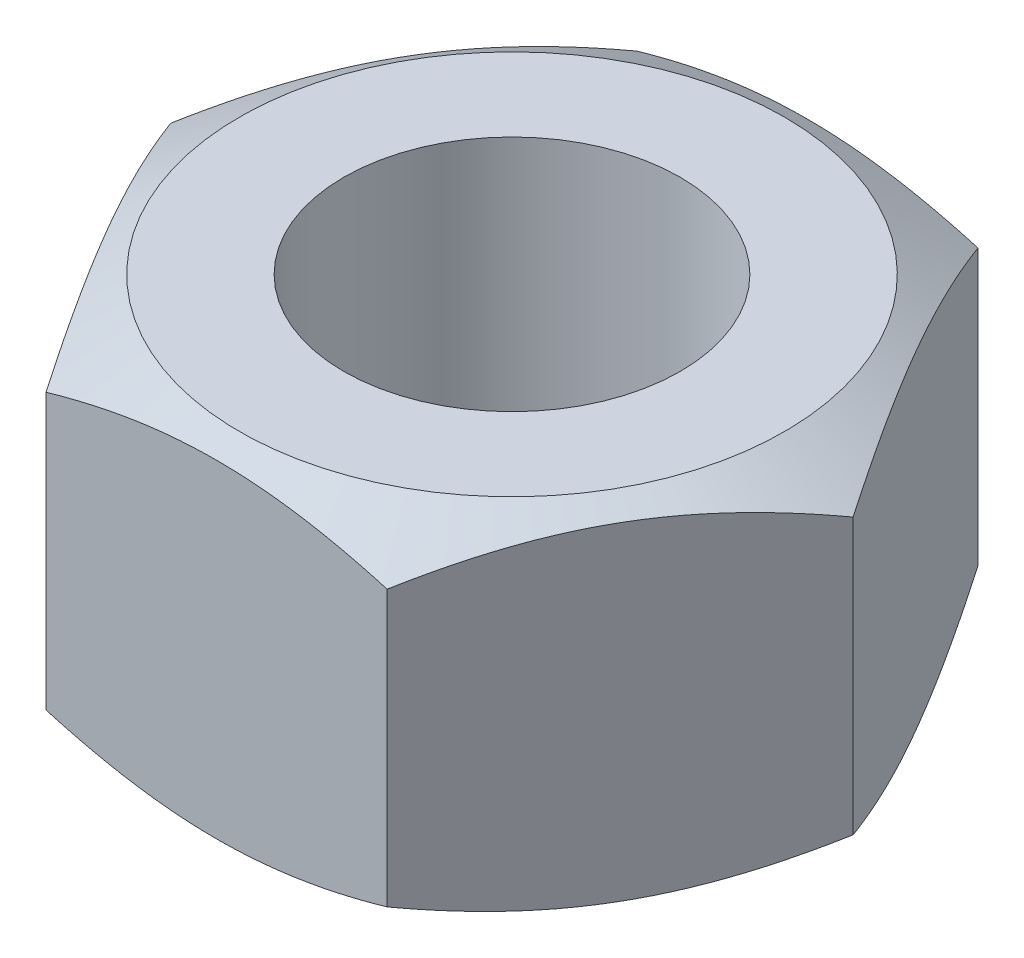
ISO-10303-21;
HEADER;
FILE_DESCRIPTION(('STEP AP214'),'2;1');
FILE_NAME('part.step','',(''),(''),'','','');
FILE_SCHEMA(('AUTOMOTIVE_DESIGN { 1 0 10303 214 1 1 1 1 }'));
ENDSEC;
DATA;
#1=APPLICATION_CONTEXT('core data for automotive mechanical design processes');
#2=APPLICATION_PROTOCOL_DEFINITION('international standard','automotive_design',2000,#1);
#3=PRODUCT_CONTEXT('',#1,'mechanical');
#4=PRODUCT('Part','Part','',(#3));
#5=PRODUCT_RELATED_PRODUCT_CATEGORY('part','',(#4));
#6=PRODUCT_DEFINITION_FORMATION('','',#4);
#7=PRODUCT_DEFINITION_CONTEXT('part definition',#1,'design');
#8=PRODUCT_DEFINITION('design','',#6,#7);
#9=PRODUCT_DEFINITION_SHAPE('','',#8);
#10=(LENGTH_UNIT() NAMED_UNIT(*) SI_UNIT(.MILLI.,.METRE.));
#11=(NAMED_UNIT(*) PLANE_ANGLE_UNIT() SI_UNIT($,.RADIAN.));
#12=(NAMED_UNIT(*) SI_UNIT($,.STERADIAN.) SOLID_ANGLE_UNIT());
#13=UNCERTAINTY_MEASURE_WITH_UNIT(LENGTH_MEASURE(1.E-05),#10,'distance_accuracy_value','');
#14=(GEOMETRIC_REPRESENTATION_CONTEXT(3) GLOBAL_UNCERTAINTY_ASSIGNED_CONTEXT((#13)) GLOBAL_UNIT_ASSIGNED_CONTEXT((#10,
#11,#12)) REPRESENTATION_CONTEXT('',''));
#15=CARTESIAN_POINT('',(0.,0.,0.));
#16=DIRECTION('',(0.,0.,1.));
#17=DIRECTION('',(1.,0.,0.));
#18=AXIS2_PLACEMENT_3D('',#15,#16,#17);
#19=CARTESIAN_POINT('',(5.19615242270664,10.8,9.));
#20=DIRECTION('',(-0.866025403784439,0.,-0.5));
#21=DIRECTION('',(-0.5,0.,0.866025403784439));
#22=AXIS2_PLACEMENT_3D('',#19,#20,#21);
#23=PLANE('',#22);
#24=CARTESIAN_POINT('',(10.3924203154671,1.20805943350388,-0.000199999999992708));
#25=CARTESIAN_POINT('',(10.2782163639798,1.1421271903068,0.197607046401223));
#26=CARTESIAN_POINT('',(10.1635669787649,1.07918659764306,0.396185606649952));
#27=CARTESIAN_POINT('',(9.9333371508339,0.960114186088279,0.794955366044217));
#28=CARTESIAN_POINT('',(9.81775632901308,0.903985306184805,0.995147221818459));
#29=CARTESIAN_POINT('',(9.58544915100228,0.799297149161704,1.39751505709611));
#30=CARTESIAN_POINT('',(9.46872074181186,0.750755961345527,1.59969459250061));
#31=CARTESIAN_POINT('',(9.23447001335913,0.662293705220661,2.00542875589076));
#32=CARTESIAN_POINT('',(9.11694786135374,0.622370875916014,2.20898309417892));
#33=CARTESIAN_POINT('',(8.88408932604662,0.552829862579855,2.61230590830693));
#34=CARTESIAN_POINT('',(8.76877014301847,0.522982691280541,2.81204459239902));
#35=CARTESIAN_POINT('',(8.53761579013204,0.472938498291823,3.21241567598901));
#36=CARTESIAN_POINT('',(8.42178066677661,0.45274062397028,3.41304799494162));
#37=CARTESIAN_POINT('',(8.18990950036671,0.422499535830088,3.81466063597383));
#38=CARTESIAN_POINT('',(8.07387383570153,0.412444798017045,4.01564030266395));
#39=CARTESIAN_POINT('',(7.84169571742973,0.402707523577824,4.41778459991644));
#40=CARTESIAN_POINT('',(7.72555326723328,0.403024666497497,4.61894922457223));
#41=CARTESIAN_POINT('',(7.50842142195782,0.413309140585915,4.99503261253052));
#42=CARTESIAN_POINT('',(7.40741671639994,0.422021928463139,5.1699778943603));
#43=CARTESIAN_POINT('',(7.20564389241818,0.447122528498113,5.51945867708336));
#44=CARTESIAN_POINT('',(7.10487579040239,0.463510858013412,5.69399414955698));
#45=CARTESIAN_POINT('',(6.8029615939808,0.523801744668573,6.21692487728551));
#46=CARTESIAN_POINT('',(6.60234990505054,0.578822670773872,6.56439451510492));
#47=CARTESIAN_POINT('',(6.19899850762261,0.716375664757895,7.263019628754));
#48=CARTESIAN_POINT('',(5.99631027619253,0.799490807059852,7.61408594368717));
#49=CARTESIAN_POINT('',(5.59395639760764,0.988127727869206,8.3109833040186));
#50=CARTESIAN_POINT('',(5.39428559809854,1.0936052013261,8.65682327355628));
#51=CARTESIAN_POINT('',(5.1960369526528,1.20805943350388,9.0002));
#52=B_SPLINE_CURVE_WITH_KNOTS('',3,(#24,#25,#26,#27,#28,#29,#30,#31,#32,#33,#34,#35,#36,#37,#38,
#39,#40,#41,#42,#43,#44,#45,#46,#47,#48,#49,#50,#51),.UNSPECIFIED.,.F.,.F.,(4,2,2,2,2,2,2,2,2,2,
2,2,2,4),(0.,0.713219249102578,1.42674513853509,2.14194697262263,2.85700253034481,
3.55449749123035,4.25193080859215,4.94857085059646,5.64518936892663,6.25162976378284,
6.85811104066341,8.07193747617894,9.31268391793541,10.5509947443908),.UNSPECIFIED.);
#53=CARTESIAN_POINT('',(10.3923048454133,1.20799276572611,0.));
#54=VERTEX_POINT('',#53);
#55=CARTESIAN_POINT('',(5.19615242270664,1.20799276572611,9.));
#56=VERTEX_POINT('',#55);
#57=EDGE_CURVE('E68',#54,#56,#52,.T.);
#58=ORIENTED_EDGE('',*,*,#57,.F.);
#59=DIRECTION('',(0.,-1.,0.));
#60=VECTOR('',#59,1.);
#61=CARTESIAN_POINT('',(10.3923048454133,10.8,0.));
#62=LINE('',#61,#60);
#63=CARTESIAN_POINT('',(10.3923048454133,9.59200723427391,0.));
#64=VERTEX_POINT('',#63);
#65=EDGE_CURVE('E61',#64,#54,#62,.T.);
#66=ORIENTED_EDGE('',*,*,#65,.F.);
#67=CARTESIAN_POINT('',(5.1960369526528,9.59194056649615,9.0002));
#68=CARTESIAN_POINT('',(5.31024090414015,9.65787280969322,8.80239295359878));
#69=CARTESIAN_POINT('',(5.42489028935504,9.72081340235697,8.60381439335005));
#70=CARTESIAN_POINT('',(5.655120117286,9.83988581391174,8.20504463395578));
#71=CARTESIAN_POINT('',(5.77070093910683,9.89601469381521,8.00485277818155));
#72=CARTESIAN_POINT('',(6.00300811711763,10.0007028508383,7.6024849429039));
#73=CARTESIAN_POINT('',(6.11973652630805,10.0492440386545,7.4003054074994));
#74=CARTESIAN_POINT('',(6.35398725476078,10.1377062947794,6.99457124410925));
#75=CARTESIAN_POINT('',(6.47150940676617,10.177629124084,6.79101690582109));
#76=CARTESIAN_POINT('',(6.70436794207329,10.2471701374202,6.38769409169308));
#77=CARTESIAN_POINT('',(6.81968712510144,10.2770173087195,6.18795540760099));
#78=CARTESIAN_POINT('',(7.05084147798786,10.3270615017082,5.787584324011));
#79=CARTESIAN_POINT('',(7.16667660134329,10.3472593760297,5.58695200505839));
#80=CARTESIAN_POINT('',(7.39854776775319,10.3775004641699,5.18533936402618));
#81=CARTESIAN_POINT('',(7.51458343241837,10.387555201983,4.98435969733606));
#82=CARTESIAN_POINT('',(7.74676155069017,10.3972924764222,4.58221540008358));
#83=CARTESIAN_POINT('',(7.86290400088662,10.3969753335025,4.38105077542778));
#84=CARTESIAN_POINT('',(8.08003584616208,10.3866908594141,4.0049673874695));
#85=CARTESIAN_POINT('',(8.18104055171997,10.3779780715369,3.83002210563971));
#86=CARTESIAN_POINT('',(8.38281337570172,10.3528774715019,3.48054132291665));
#87=CARTESIAN_POINT('',(8.48358147771751,10.3364891419866,3.30600585044303));
#88=CARTESIAN_POINT('',(8.7854956741391,10.2761982553314,2.7830751227145));
#89=CARTESIAN_POINT('',(8.98610736306936,10.2211773292261,2.43560548489509));
#90=CARTESIAN_POINT('',(9.38945876049729,10.0836243352421,1.736980371246));
#91=CARTESIAN_POINT('',(9.59214699192737,10.0005091929402,1.38591405631283));
#92=CARTESIAN_POINT('',(9.99450087051226,9.81187227213081,0.689016695981401));
#93=CARTESIAN_POINT('',(10.1941716700214,9.70639479867392,0.343176726443727));
#94=CARTESIAN_POINT('',(10.3924203154671,9.59194056649614,-0.000199999999992939));
#95=B_SPLINE_CURVE_WITH_KNOTS('',3,(#67,#68,#69,#70,#71,#72,#73,#74,#75,#76,#77,#78,#79,#80,#81,
#82,#83,#84,#85,#86,#87,#88,#89,#90,#91,#92,#93,#94),.UNSPECIFIED.,.F.,.F.,(4,2,2,2,2,2,2,2,2,2,
2,2,2,4),(0.,0.713219249102578,1.42674513853509,2.14194697262263,2.8570025303448,
3.55449749123034,4.25193080859214,4.94857085059644,5.64518936892662,6.25162976378283,
6.85811104066339,8.07193747617893,9.3126839179354,10.5509947443907),.UNSPECIFIED.);
#96=CARTESIAN_POINT('',(5.19615242270664,9.59200723427391,9.));
#97=VERTEX_POINT('',#96);
#98=EDGE_CURVE('E142',#97,#64,#95,.T.);
#99=ORIENTED_EDGE('',*,*,#98,.F.);
#100=DIRECTION('',(0.,-1.,0.));
#101=VECTOR('',#100,1.);
#102=CARTESIAN_POINT('',(5.19615242270664,10.8,9.));
#103=LINE('',#102,#101);
#104=EDGE_CURVE('E135',#97,#56,#103,.T.);
#105=ORIENTED_EDGE('',*,*,#104,.T.);
#106=EDGE_LOOP('',(#58,#66,#99,#105));
#107=FACE_BOUND('',#106,.T.);
#108=ADVANCED_FACE('F47',(#107),#23,.F.);
#109=CARTESIAN_POINT('',(10.3923048454133,10.8,0.));
#110=DIRECTION('',(-0.866025403784438,0.,0.5));
#111=DIRECTION('',(0.5,0.,0.866025403784438));
#112=AXIS2_PLACEMENT_3D('',#109,#110,#111);
#113=PLANE('',#112);
#114=CARTESIAN_POINT('',(5.19603695265279,1.20805943350387,-9.0002));
#115=CARTESIAN_POINT('',(5.31024090414013,1.1421271903068,-8.80239295359879));
#116=CARTESIAN_POINT('',(5.42489028935503,1.07918659764305,-8.60381439335006));
#117=CARTESIAN_POINT('',(5.65512011728599,0.960114186088276,-8.20504463395579));
#118=CARTESIAN_POINT('',(5.77070093910682,0.903985306184802,-8.00485277818155));
#119=CARTESIAN_POINT('',(6.00300811711761,0.7992971491617,-7.6024849429039));
#120=CARTESIAN_POINT('',(6.11973652630803,0.750755961345524,-7.4003054074994));
#121=CARTESIAN_POINT('',(6.35398725476076,0.662293705220657,-6.99457124410925));
#122=CARTESIAN_POINT('',(6.47150940676615,0.622370875916011,-6.79101690582109));
#123=CARTESIAN_POINT('',(6.70436794207327,0.552829862579851,-6.38769409169309));
#124=CARTESIAN_POINT('',(6.81968712510142,0.522982691280536,-6.187955407601));
#125=CARTESIAN_POINT('',(7.05084147798785,0.472938498291818,-5.78758432401101));
#126=CARTESIAN_POINT('',(7.16667660134328,0.452740623970276,-5.58695200505839));
#127=CARTESIAN_POINT('',(7.39854776775318,0.422499535830083,-5.18533936402618));
#128=CARTESIAN_POINT('',(7.51458343241836,0.41244479801704,-4.98435969733606));
#129=CARTESIAN_POINT('',(7.74676155069016,0.402707523577819,-4.58221540008358));
#130=CARTESIAN_POINT('',(7.86290400088661,0.403024666497493,-4.38105077542778));
#131=CARTESIAN_POINT('',(8.08003584616207,0.41330914058591,-4.0049673874695));
#132=CARTESIAN_POINT('',(8.18104055171996,0.422021928463134,-3.83002210563971));
#133=CARTESIAN_POINT('',(8.38281337570172,0.447122528498107,-3.48054132291665));
#134=CARTESIAN_POINT('',(8.4835814777175,0.463510858013407,-3.30600585044303));
#135=CARTESIAN_POINT('',(8.7854956741391,0.523801744668568,-2.78307512271449));
#136=CARTESIAN_POINT('',(8.98610736306936,0.578822670773868,-2.43560548489508));
#137=CARTESIAN_POINT('',(9.38945876049729,0.716375664757892,-1.736980371246));
#138=CARTESIAN_POINT('',(9.59214699192737,0.799490807059849,-1.38591405631282));
#139=CARTESIAN_POINT('',(9.99450087051226,0.988127727869205,-0.689016695981389));
#140=CARTESIAN_POINT('',(10.1941716700214,1.0936052013261,-0.343176726443715));
#141=CARTESIAN_POINT('',(10.3924203154671,1.20805943350388,0.000200000000007278));
#142=B_SPLINE_CURVE_WITH_KNOTS('',3,(#114,#115,#116,#117,#118,#119,#120,#121,#122,#123,#124,
#125,#126,#127,#128,#129,#130,#131,#132,#133,#134,#135,#136,#137,#138,#139,#140,#141),
.UNSPECIFIED.,.F.,.F.,(4,2,2,2,2,2,2,2,2,2,2,2,2,4),(0.,0.713219249102578,1.42674513853509,
2.14194697262263,2.85700253034481,3.55449749123034,4.25193080859215,4.94857085059646,
5.64518936892663,6.25162976378284,6.85811104066341,8.07193747617895,9.31268391793543,
10.5509947443908),.UNSPECIFIED.);
#143=CARTESIAN_POINT('',(5.19615242270663,1.20799276572611,-9.));
#144=VERTEX_POINT('',#143);
#145=EDGE_CURVE('E106',#144,#54,#142,.T.);
#146=ORIENTED_EDGE('',*,*,#145,.F.);
#147=DIRECTION('',(0.,-1.,0.));
#148=VECTOR('',#147,1.);
#149=CARTESIAN_POINT('',(5.19615242270663,10.8,-9.));
#150=LINE('',#149,#148);
#151=CARTESIAN_POINT('',(5.19615242270663,9.59200723427391,-9.));
#152=VERTEX_POINT('',#151);
#153=EDGE_CURVE('E119',#152,#144,#150,.T.);
#154=ORIENTED_EDGE('',*,*,#153,.F.);
#155=CARTESIAN_POINT('',(10.3924203154671,9.59194056649614,0.000200000000007406));
#156=CARTESIAN_POINT('',(10.2782163639798,9.65787280969322,-0.197607046401208));
#157=CARTESIAN_POINT('',(10.1635669787649,9.72081340235696,-0.396185606649936));
#158=CARTESIAN_POINT('',(9.93333715083391,9.83988581391174,-0.794955366044201));
#159=CARTESIAN_POINT('',(9.81775632901308,9.89601469381521,-0.995147221818442));
#160=CARTESIAN_POINT('',(9.58544915100228,10.0007028508383,-1.39751505709609));
#161=CARTESIAN_POINT('',(9.46872074181186,10.0492440386545,-1.59969459250059));
#162=CARTESIAN_POINT('',(9.23447001335913,10.1377062947794,-2.00542875589074));
#163=CARTESIAN_POINT('',(9.11694786135374,10.177629124084,-2.2089830941789));
#164=CARTESIAN_POINT('',(8.88408932604662,10.2471701374202,-2.6123059083069));
#165=CARTESIAN_POINT('',(8.76877014301847,10.2770173087195,-2.81204459239899));
#166=CARTESIAN_POINT('',(8.53761579013205,10.3270615017082,-3.21241567598898));
#167=CARTESIAN_POINT('',(8.42178066677662,10.3472593760297,-3.41304799494159));
#168=CARTESIAN_POINT('',(8.18990950036671,10.3775004641699,-3.81466063597381));
#169=CARTESIAN_POINT('',(8.07387383570154,10.387555201983,-4.01564030266392));
#170=CARTESIAN_POINT('',(7.84169571742974,10.3972924764222,-4.41778459991641));
#171=CARTESIAN_POINT('',(7.72555326723328,10.3969753335025,-4.61894922457221));
#172=CARTESIAN_POINT('',(7.50842142195782,10.3866908594141,-4.99503261253049));
#173=CARTESIAN_POINT('',(7.40741671639994,10.3779780715369,-5.16997789436028));
#174=CARTESIAN_POINT('',(7.20564389241818,10.3528774715019,-5.51945867708334));
#175=CARTESIAN_POINT('',(7.10487579040239,10.3364891419866,-5.69399414955696));
#176=CARTESIAN_POINT('',(6.8029615939808,10.2761982553314,-6.2169248772855));
#177=CARTESIAN_POINT('',(6.60234990505054,10.2211773292261,-6.56439451510491));
#178=CARTESIAN_POINT('',(6.1989985076226,10.0836243352421,-7.26301962875399));
#179=CARTESIAN_POINT('',(5.99631027619253,10.0005091929402,-7.61408594368717));
#180=CARTESIAN_POINT('',(5.59395639760763,9.81187227213082,-8.3109833040186));
#181=CARTESIAN_POINT('',(5.39428559809852,9.70639479867392,-8.65682327355628));
#182=CARTESIAN_POINT('',(5.19603695265279,9.59194056649615,-9.0002));
#183=B_SPLINE_CURVE_WITH_KNOTS('',3,(#155,#156,#157,#158,#159,#160,#161,#162,#163,#164,#165,
#166,#167,#168,#169,#170,#171,#172,#173,#174,#175,#176,#177,#178,#179,#180,#181,#182),
.UNSPECIFIED.,.F.,.F.,(4,2,2,2,2,2,2,2,2,2,2,2,2,4),(0.,0.713219249102577,1.42674513853509,
2.14194697262263,2.8570025303448,3.55449749123034,4.25193080859214,4.94857085059645,
5.64518936892662,6.25162976378283,6.8581110406634,8.07193747617894,9.31268391793542,
10.5509947443908),.UNSPECIFIED.);
#184=EDGE_CURVE('E150',#64,#152,#183,.T.);
#185=ORIENTED_EDGE('',*,*,#184,.F.);
#186=ORIENTED_EDGE('',*,*,#65,.T.);
#187=EDGE_LOOP('',(#146,#154,#185,#186));
#188=FACE_BOUND('',#187,.T.);
#189=ADVANCED_FACE('F117',(#188),#113,.F.);
#190=CARTESIAN_POINT('',(5.19615242270663,10.8,-9.));
#191=DIRECTION('',(0.,0.,1.));
#192=DIRECTION('',(1.,0.,0.));
#193=AXIS2_PLACEMENT_3D('',#190,#191,#192);
#194=PLANE('',#193);
#195=CARTESIAN_POINT('',(-13.7249855399579,4.68384326532164,-9.));
#196=CARTESIAN_POINT('',(-13.5276337342672,4.58856269936757,-9.));
#197=CARTESIAN_POINT('',(-13.3300417864601,4.49377977328804,-9.));
#198=CARTESIAN_POINT('',(-12.9343268590475,4.30532355998274,-9.));
#199=CARTESIAN_POINT('',(-12.7362038735499,4.21165028513166,-9.));
#200=CARTESIAN_POINT('',(-12.1409033088051,3.93243891356956,-9.));
#201=CARTESIAN_POINT('',(-11.7428592721498,3.74874081619141,-9.));
#202=CARTESIAN_POINT('',(-10.9416949639722,3.38638542870103,-9.));
#203=CARTESIAN_POINT('',(-10.5385586417151,3.20776353576247,-9.));
#204=CARTESIAN_POINT('',(-9.72895250752011,2.85827000603549,-9.));
#205=CARTESIAN_POINT('',(-9.32248287261902,2.68739796074984,-9.));
#206=CARTESIAN_POINT('',(-8.50077817788832,2.35355049957567,-9.));
#207=CARTESIAN_POINT('',(-8.08549615408511,2.19069003475644,-9.));
#208=CARTESIAN_POINT('',(-7.25001514088078,1.8778643229401,-9.));
#209=CARTESIAN_POINT('',(-6.82981560831018,1.72790051602765,-9.));
#210=CARTESIAN_POINT('',(-5.98470772532507,1.44493948107825,-9.));
#211=CARTESIAN_POINT('',(-5.5598117542135,1.3119056868681,-9.));
#212=CARTESIAN_POINT('',(-4.70399755128371,1.06715889956851,-9.));
#213=CARTESIAN_POINT('',(-4.27308128535743,0.955439113441072,-9.));
#214=CARTESIAN_POINT('',(-3.40483771836842,0.758782866133476,-9.));
#215=CARTESIAN_POINT('',(-2.96750806363982,0.6738565091016,-9.));
#216=CARTESIAN_POINT('',(-2.30771360404508,0.570846356411626,-9.));
#217=CARTESIAN_POINT('',(-2.08712167183149,0.540570665835808,-9.));
#218=CARTESIAN_POINT('',(-1.64492239992361,0.488742225518419,-9.));
#219=CARTESIAN_POINT('',(-1.42331515816054,0.467188651685815,-9.));
#220=CARTESIAN_POINT('',(-0.980759162441027,0.433381938058016,-9.));
#221=CARTESIAN_POINT('',(-0.759814728526827,0.421072468274216,-9.));
#222=CARTESIAN_POINT('',(-0.3176035824195,0.405818086543466,-9.));
#223=CARTESIAN_POINT('',(-0.0963368750823988,0.402873034924185,-9.));
#224=CARTESIAN_POINT('',(0.346060762024319,0.406417425074876,-9.));
#225=CARTESIAN_POINT('',(0.567191712405611,0.412904268440314,-9.));
#226=CARTESIAN_POINT('',(1.00898966193178,0.435152769056466,-9.));
#227=CARTESIAN_POINT('',(1.22965663523251,0.450914929902834,-9.));
#228=CARTESIAN_POINT('',(1.76613205406334,0.500183896989714,-9.));
#229=CARTESIAN_POINT('',(2.08151362388166,0.538429422742406,-9.));
#230=CARTESIAN_POINT('',(2.70976827064533,0.631724016390834,-9.));
#231=CARTESIAN_POINT('',(3.02264096077553,0.686775626177469,-9.));
#232=CARTESIAN_POINT('',(3.95806021894622,0.874374144890283,-9.));
#233=CARTESIAN_POINT('',(4.57618097894058,1.02923781798821,-9.));
#234=CARTESIAN_POINT('',(5.50067616258658,1.29579321029491,-9.));
#235=CARTESIAN_POINT('',(5.81189263350013,1.39164024988015,-9.));
#236=CARTESIAN_POINT('',(6.43131907095997,1.59277441759255,-9.));
#237=CARTESIAN_POINT('',(6.7395287659735,1.69806238970974,-9.));
#238=CARTESIAN_POINT('',(7.35140198858048,1.91583117106334,-9.));
#239=CARTESIAN_POINT('',(7.65508137790937,2.02826786324149,-9.));
#240=CARTESIAN_POINT('',(8.25986402639824,2.259577515373,-9.));
#241=CARTESIAN_POINT('',(8.56096813625738,2.3784482467161,-9.));
#242=CARTESIAN_POINT('',(8.86098927238923,2.49993194277628,-9.));
#243=B_SPLINE_CURVE_WITH_KNOTS('',3,(#195,#196,#197,#198,#199,#200,#201,#202,#203,#204,#205,
#206,#207,#208,#209,#210,#211,#212,#213,#214,#215,#216,#217,#218,#219,#220,#221,#222,#223,#224,
#225,#226,#227,#228,#229,#230,#231,#232,#233,#234,#235,#236,#237,#238,#239,#240,#241,#242),
.UNSPECIFIED.,.F.,.F.,(4,2,2,2,2,2,2,2,2,2,2,2,2,2,2,2,2,2,2,2,2,2,2,4),(0.,0.657444591566226,
1.31489650797594,2.63001748689262,3.95276266247426,5.27543803446335,6.6134963044532,
7.95170379309822,9.2869700544346,10.6218100363487,11.9571528036173,12.6249869903804,
13.2927580634807,13.9564262223627,14.6200844824437,15.2835599451192,15.9470714339677,
16.8996052843126,17.8522832751789,19.7613234682762,20.7381734681441,21.7151108825961,
22.6865150288128,23.6575848287431),.UNSPECIFIED.);
#244=CARTESIAN_POINT('',(-5.19615242270663,1.20799276572611,-9.));
#245=VERTEX_POINT('',#244);
#246=EDGE_CURVE('E103',#245,#144,#243,.T.);
#247=ORIENTED_EDGE('',*,*,#246,.F.);
#248=DIRECTION('',(0.,-1.,0.));
#249=VECTOR('',#248,1.);
#250=CARTESIAN_POINT('',(-5.19615242270663,10.8,-9.));
#251=LINE('',#250,#249);
#252=CARTESIAN_POINT('',(-5.19615242270663,9.59200723427391,-9.));
#253=VERTEX_POINT('',#252);
#254=EDGE_CURVE('E125',#253,#245,#251,.T.);
#255=ORIENTED_EDGE('',*,*,#254,.F.);
#256=CARTESIAN_POINT('',(-13.7249855399579,6.11615673467844,-9.));
#257=CARTESIAN_POINT('',(-13.5276337342672,6.21143730063251,-9.));
#258=CARTESIAN_POINT('',(-13.3300417864601,6.30622022671204,-9.));
#259=CARTESIAN_POINT('',(-12.9343268590475,6.49467644001733,-9.));
#260=CARTESIAN_POINT('',(-12.7362038735499,6.58834971486841,-9.));
#261=CARTESIAN_POINT('',(-12.1409033088051,6.8675610864305,-9.));
#262=CARTESIAN_POINT('',(-11.7428592721498,7.05125918380865,-9.));
#263=CARTESIAN_POINT('',(-10.9416949639722,7.41361457129902,-9.));
#264=CARTESIAN_POINT('',(-10.5385586417151,7.59223646423758,-9.));
#265=CARTESIAN_POINT('',(-9.72895250752011,7.94172999396455,-9.));
#266=CARTESIAN_POINT('',(-9.32248287261903,8.1126020392502,-9.));
#267=CARTESIAN_POINT('',(-8.50077817788833,8.44644950042436,-9.));
#268=CARTESIAN_POINT('',(-8.08549615408511,8.6093099652436,-9.));
#269=CARTESIAN_POINT('',(-7.25001514088078,8.92213567705993,-9.));
#270=CARTESIAN_POINT('',(-6.82981560831019,9.07209948397238,-9.));
#271=CARTESIAN_POINT('',(-5.98470772532508,9.35506051892178,-9.));
#272=CARTESIAN_POINT('',(-5.55981175421351,9.48809431313192,-9.));
#273=CARTESIAN_POINT('',(-4.70399755128371,9.73284110043151,-9.));
#274=CARTESIAN_POINT('',(-4.27308128535744,9.84456088655894,-9.));
#275=CARTESIAN_POINT('',(-3.40483771836842,10.0412171338665,-9.));
#276=CARTESIAN_POINT('',(-2.96750806363983,10.1261434908984,-9.));
#277=CARTESIAN_POINT('',(-2.30771360404508,10.2291536435884,-9.));
#278=CARTESIAN_POINT('',(-2.08712167183149,10.2594293341642,-9.));
#279=CARTESIAN_POINT('',(-1.64492239992361,10.3112577744816,-9.));
#280=CARTESIAN_POINT('',(-1.42331515816054,10.3328113483142,-9.));
#281=CARTESIAN_POINT('',(-0.980759162441032,10.366618061942,-9.));
#282=CARTESIAN_POINT('',(-0.759814728526832,10.3789275317258,-9.));
#283=CARTESIAN_POINT('',(-0.317603582419506,10.3941819134565,-9.));
#284=CARTESIAN_POINT('',(-0.096336875082406,10.3971269650758,-9.));
#285=CARTESIAN_POINT('',(0.346060762024309,10.3935825749251,-9.));
#286=CARTESIAN_POINT('',(0.5671917124056,10.3870957315597,-9.));
#287=CARTESIAN_POINT('',(1.00898966193177,10.3648472309435,-9.));
#288=CARTESIAN_POINT('',(1.2296566352325,10.3490850700972,-9.));
#289=CARTESIAN_POINT('',(1.76613205406333,10.2998161030103,-9.));
#290=CARTESIAN_POINT('',(2.08151362388166,10.2615705772576,-9.));
#291=CARTESIAN_POINT('',(2.70976827064534,10.1682759836092,-9.));
#292=CARTESIAN_POINT('',(3.02264096077554,10.1132243738225,-9.));
#293=CARTESIAN_POINT('',(3.95806021894625,9.92562585510973,-9.));
#294=CARTESIAN_POINT('',(4.57618097894062,9.77076218201179,-9.));
#295=CARTESIAN_POINT('',(5.50067616258664,9.50420678970509,-9.));
#296=CARTESIAN_POINT('',(5.8118926335002,9.40835975011985,-9.));
#297=CARTESIAN_POINT('',(6.43131907096006,9.20722558240745,-9.));
#298=CARTESIAN_POINT('',(6.73952876597359,9.10193761029026,-9.));
#299=CARTESIAN_POINT('',(7.35140198858059,8.88416882893666,-9.));
#300=CARTESIAN_POINT('',(7.65508137790948,8.7717321367585,-9.));
#301=CARTESIAN_POINT('',(8.25986402639837,8.54042248462699,-9.));
#302=CARTESIAN_POINT('',(8.56096813625751,8.42155175328388,-9.));
#303=CARTESIAN_POINT('',(8.86098927238937,8.30006805722371,-9.));
#304=B_SPLINE_CURVE_WITH_KNOTS('',3,(#256,#257,#258,#259,#260,#261,#262,#263,#264,#265,#266,
#267,#268,#269,#270,#271,#272,#273,#274,#275,#276,#277,#278,#279,#280,#281,#282,#283,#284,#285,
#286,#287,#288,#289,#290,#291,#292,#293,#294,#295,#296,#297,#298,#299,#300,#301,#302,#303),
.UNSPECIFIED.,.F.,.F.,(4,2,2,2,2,2,2,2,2,2,2,2,2,2,2,2,2,2,2,2,2,2,2,4),(0.,0.657444591566225,
1.31489650797594,2.63001748689261,3.95276266247424,5.27543803446333,6.61349630445318,
7.9517037930982,9.28697005443458,10.6218100363487,11.9571528036173,12.6249869903803,
13.2927580634807,13.9564262223627,14.6200844824436,15.2835599451192,15.9470714339677,
16.8996052843126,17.8522832751789,19.7613234682763,20.7381734681442,21.7151108825962,
22.6865150288129,23.6575848287433),.UNSPECIFIED.);
#305=EDGE_CURVE('E124',#152,#253,#304,.F.);
#306=ORIENTED_EDGE('',*,*,#305,.F.);
#307=ORIENTED_EDGE('',*,*,#153,.T.);
#308=EDGE_LOOP('',(#247,#255,#306,#307));
#309=FACE_BOUND('',#308,.T.);
#310=ADVANCED_FACE('F123',(#309),#194,.F.);
#311=CARTESIAN_POINT('',(-5.19615242270663,10.8,-9.));
#312=DIRECTION('',(0.866025403784439,0.,0.5));
#313=DIRECTION('',(0.5,0.,-0.866025403784439));
#314=AXIS2_PLACEMENT_3D('',#311,#312,#313);
#315=PLANE('',#314);
#316=CARTESIAN_POINT('',(-10.3924203154671,1.20805943350387,0.000199999999997882));
#317=CARTESIAN_POINT('',(-10.2782163639798,1.1421271903068,-0.197607046401219));
#318=CARTESIAN_POINT('',(-10.1635669787649,1.07918659764305,-0.396185606649947));
#319=CARTESIAN_POINT('',(-9.9333371508339,0.960114186088276,-0.794955366044212));
#320=CARTESIAN_POINT('',(-9.81775632901307,0.903985306184802,-0.995147221818452));
#321=CARTESIAN_POINT('',(-9.58544915100227,0.799297149161701,-1.3975150570961));
#322=CARTESIAN_POINT('',(-9.46872074181185,0.750755961345524,-1.5996945925006));
#323=CARTESIAN_POINT('',(-9.23447001335912,0.662293705220658,-2.00542875589075));
#324=CARTESIAN_POINT('',(-9.11694786135373,0.62237087591601,-2.20898309417891));
#325=CARTESIAN_POINT('',(-8.88408932604661,0.552829862579851,-2.61230590830692));
#326=CARTESIAN_POINT('',(-8.76877014301846,0.522982691280536,-2.81204459239901));
#327=CARTESIAN_POINT('',(-8.53761579013204,0.472938498291818,-3.212415675989));
#328=CARTESIAN_POINT('',(-8.42178066677661,0.452740623970276,-3.41304799494161));
#329=CARTESIAN_POINT('',(-8.18990950036671,0.422499535830084,-3.81466063597382));
#330=CARTESIAN_POINT('',(-8.07387383570153,0.412444798017041,-4.01564030266394));
#331=CARTESIAN_POINT('',(-7.84169571742973,0.40270752357782,-4.41778459991643));
#332=CARTESIAN_POINT('',(-7.72555326723327,0.403024666497494,-4.61894922457223));
#333=CARTESIAN_POINT('',(-7.50842142195782,0.413309140585911,-4.99503261253051));
#334=CARTESIAN_POINT('',(-7.40741671639993,0.422021928463134,-5.16997789436029));
#335=CARTESIAN_POINT('',(-7.20564389241817,0.447122528498108,-5.51945867708335));
#336=CARTESIAN_POINT('',(-7.10487579040239,0.463510858013408,-5.69399414955697));
#337=CARTESIAN_POINT('',(-6.80296159398079,0.523801744668571,-6.21692487728551));
#338=CARTESIAN_POINT('',(-6.60234990505054,0.578822670773869,-6.56439451510492));
#339=CARTESIAN_POINT('',(-6.1989985076226,0.716375664757892,-7.263019628754));
#340=CARTESIAN_POINT('',(-5.99631027619253,0.799490807059849,-7.61408594368717));
#341=CARTESIAN_POINT('',(-5.59395639760764,0.988127727869205,-8.31098330401861));
#342=CARTESIAN_POINT('',(-5.39428559809853,1.0936052013261,-8.65682327355628));
#343=CARTESIAN_POINT('',(-5.19603695265279,1.20805943350388,-9.0002));
#344=B_SPLINE_CURVE_WITH_KNOTS('',3,(#316,#317,#318,#319,#320,#321,#322,#323,#324,#325,#326,
#327,#328,#329,#330,#331,#332,#333,#334,#335,#336,#337,#338,#339,#340,#341,#342,#343),
.UNSPECIFIED.,.F.,.F.,(4,2,2,2,2,2,2,2,2,2,2,2,2,4),(0.,0.713219249102577,1.42674513853509,
2.14194697262263,2.85700253034481,3.55449749123034,4.25193080859215,4.94857085059646,
5.64518936892663,6.25162976378284,6.85811104066341,8.07193747617894,9.31268391793542,
10.5509947443908),.UNSPECIFIED.);
#345=CARTESIAN_POINT('',(-10.3923048454133,1.20799276572611,0.));
#346=VERTEX_POINT('',#345);
#347=EDGE_CURVE('E108',#346,#245,#344,.T.);
#348=ORIENTED_EDGE('',*,*,#347,.F.);
#349=DIRECTION('',(0.,-1.,0.));
#350=VECTOR('',#349,1.);
#351=CARTESIAN_POINT('',(-10.3923048454133,10.8,0.));
#352=LINE('',#351,#350);
#353=CARTESIAN_POINT('',(-10.3923048454133,9.59200723427391,0.));
#354=VERTEX_POINT('',#353);
#355=EDGE_CURVE('E127',#354,#346,#352,.T.);
#356=ORIENTED_EDGE('',*,*,#355,.F.);
#357=CARTESIAN_POINT('',(-5.19603695265279,9.59194056649615,-9.0002));
#358=CARTESIAN_POINT('',(-5.31024090414014,9.65787280969322,-8.80239295359879));
#359=CARTESIAN_POINT('',(-5.42489028935503,9.72081340235697,-8.60381439335006));
#360=CARTESIAN_POINT('',(-5.65512011728599,9.83988581391174,-8.20504463395579));
#361=CARTESIAN_POINT('',(-5.77070093910682,9.89601469381521,-8.00485277818155));
#362=CARTESIAN_POINT('',(-6.00300811711762,10.0007028508383,-7.60248494290391));
#363=CARTESIAN_POINT('',(-6.11973652630804,10.0492440386545,-7.40030540749941));
#364=CARTESIAN_POINT('',(-6.35398725476077,10.1377062947794,-6.99457124410926));
#365=CARTESIAN_POINT('',(-6.47150940676615,10.177629124084,-6.79101690582109));
#366=CARTESIAN_POINT('',(-6.70436794207327,10.2471701374202,-6.38769409169309));
#367=CARTESIAN_POINT('',(-6.81968712510142,10.2770173087195,-6.187955407601));
#368=CARTESIAN_POINT('',(-7.05084147798785,10.3270615017082,-5.78758432401101));
#369=CARTESIAN_POINT('',(-7.16667660134327,10.3472593760297,-5.5869520050584));
#370=CARTESIAN_POINT('',(-7.39854776775318,10.3775004641699,-5.18533936402619));
#371=CARTESIAN_POINT('',(-7.51458343241836,10.387555201983,-4.98435969733607));
#372=CARTESIAN_POINT('',(-7.74676155069016,10.3972924764222,-4.58221540008358));
#373=CARTESIAN_POINT('',(-7.86290400088661,10.3969753335025,-4.38105077542779));
#374=CARTESIAN_POINT('',(-8.08003584616207,10.3866908594141,-4.0049673874695));
#375=CARTESIAN_POINT('',(-8.18104055171995,10.3779780715369,-3.83002210563972));
#376=CARTESIAN_POINT('',(-8.38281337570171,10.3528774715019,-3.48054132291666));
#377=CARTESIAN_POINT('',(-8.4835814777175,10.3364891419866,-3.30600585044304));
#378=CARTESIAN_POINT('',(-8.7854956741391,10.2761982553314,-2.7830751227145));
#379=CARTESIAN_POINT('',(-8.98610736306935,10.2211773292261,-2.43560548489509));
#380=CARTESIAN_POINT('',(-9.38945876049729,10.0836243352421,-1.736980371246));
#381=CARTESIAN_POINT('',(-9.59214699192736,10.0005091929402,-1.38591405631283));
#382=CARTESIAN_POINT('',(-9.99450087051226,9.81187227213081,-0.689016695981397));
#383=CARTESIAN_POINT('',(-10.1941716700214,9.70639479867392,-0.343176726443723));
#384=CARTESIAN_POINT('',(-10.3924203154671,9.59194056649615,0.000199999999998519));
#385=B_SPLINE_CURVE_WITH_KNOTS('',3,(#357,#358,#359,#360,#361,#362,#363,#364,#365,#366,#367,
#368,#369,#370,#371,#372,#373,#374,#375,#376,#377,#378,#379,#380,#381,#382,#383,#384),
.UNSPECIFIED.,.F.,.F.,(4,2,2,2,2,2,2,2,2,2,2,2,2,4),(0.,0.713219249102576,1.42674513853509,
2.14194697262263,2.8570025303448,3.55449749123033,4.25193080859214,4.94857085059644,
5.64518936892662,6.25162976378283,6.8581110406634,8.07193747617893,9.31268391793541,
10.5509947443908),.UNSPECIFIED.);
#386=EDGE_CURVE('E178',#253,#354,#385,.T.);
#387=ORIENTED_EDGE('',*,*,#386,.F.);
#388=ORIENTED_EDGE('',*,*,#254,.T.);
#389=EDGE_LOOP('',(#348,#356,#387,#388));
#390=FACE_BOUND('',#389,.T.);
#391=ADVANCED_FACE('F191',(#390),#315,.F.);
#392=CARTESIAN_POINT('',(-10.3923048454133,10.8,0.));
#393=DIRECTION('',(0.866025403784438,0.,-0.5));
#394=DIRECTION('',(-0.5,0.,-0.866025403784439));
#395=AXIS2_PLACEMENT_3D('',#392,#393,#394);
#396=PLANE('',#395);
#397=CARTESIAN_POINT('',(-5.19603695265279,1.20805943350387,9.0002));
#398=CARTESIAN_POINT('',(-5.31024090414014,1.14212719030679,8.80239295359878));
#399=CARTESIAN_POINT('',(-5.42489028935503,1.07918659764305,8.60381439335005));
#400=CARTESIAN_POINT('',(-5.65512011728599,0.960114186088274,8.20504463395578));
#401=CARTESIAN_POINT('',(-5.77070093910682,0.9039853061848,8.00485277818155));
#402=CARTESIAN_POINT('',(-6.00300811711761,0.799297149161699,7.6024849429039));
#403=CARTESIAN_POINT('',(-6.11973652630803,0.750755961345522,7.4003054074994));
#404=CARTESIAN_POINT('',(-6.35398725476077,0.662293705220655,6.99457124410925));
#405=CARTESIAN_POINT('',(-6.47150940676615,0.622370875916008,6.79101690582109));
#406=CARTESIAN_POINT('',(-6.70436794207327,0.552829862579849,6.38769409169308));
#407=CARTESIAN_POINT('',(-6.81968712510142,0.522982691280534,6.18795540760099));
#408=CARTESIAN_POINT('',(-7.05084147798785,0.472938498291816,5.787584324011));
#409=CARTESIAN_POINT('',(-7.16667660134328,0.452740623970274,5.58695200505839));
#410=CARTESIAN_POINT('',(-7.39854776775318,0.422499535830082,5.18533936402618));
#411=CARTESIAN_POINT('',(-7.51458343241836,0.412444798017039,4.98435969733606));
#412=CARTESIAN_POINT('',(-7.74676155069016,0.402707523577818,4.58221540008357));
#413=CARTESIAN_POINT('',(-7.86290400088661,0.403024666497491,4.38105077542777));
#414=CARTESIAN_POINT('',(-8.08003584616207,0.413309140585908,4.00496738746949));
#415=CARTESIAN_POINT('',(-8.18104055171996,0.422021928463133,3.8300221056397));
#416=CARTESIAN_POINT('',(-8.38281337570172,0.447122528498106,3.48054132291665));
#417=CARTESIAN_POINT('',(-8.4835814777175,0.463510858013406,3.30600585044303));
#418=CARTESIAN_POINT('',(-8.7854956741391,0.523801744668568,2.78307512271449));
#419=CARTESIAN_POINT('',(-8.98610736306936,0.578822670773867,2.43560548489508));
#420=CARTESIAN_POINT('',(-9.38945876049729,0.71637566475789,1.736980371246));
#421=CARTESIAN_POINT('',(-9.59214699192736,0.799490807059847,1.38591405631283));
#422=CARTESIAN_POINT('',(-9.99450087051226,0.988127727869203,0.689016695981392));
#423=CARTESIAN_POINT('',(-10.1941716700214,1.0936052013261,0.343176726443719));
#424=CARTESIAN_POINT('',(-10.3924203154671,1.20805943350387,-0.000200000000000797));
#425=B_SPLINE_CURVE_WITH_KNOTS('',3,(#397,#398,#399,#400,#401,#402,#403,#404,#405,#406,#407,
#408,#409,#410,#411,#412,#413,#414,#415,#416,#417,#418,#419,#420,#421,#422,#423,#424),
.UNSPECIFIED.,.F.,.F.,(4,2,2,2,2,2,2,2,2,2,2,2,2,4),(0.,0.713219249102579,1.42674513853509,
2.14194697262263,2.85700253034481,3.55449749123034,4.25193080859215,4.94857085059645,
5.64518936892663,6.25162976378284,6.85811104066341,8.07193747617894,9.31268391793542,
10.5509947443908),.UNSPECIFIED.);
#426=CARTESIAN_POINT('',(-5.19615242270664,1.20799276572611,9.));
#427=VERTEX_POINT('',#426);
#428=EDGE_CURVE('E224',#427,#346,#425,.T.);
#429=ORIENTED_EDGE('',*,*,#428,.F.);
#430=DIRECTION('',(0.,-1.,0.));
#431=VECTOR('',#430,1.);
#432=CARTESIAN_POINT('',(-5.19615242270663,10.8,9.));
#433=LINE('',#432,#431);
#434=CARTESIAN_POINT('',(-5.19615242270663,9.59200723427392,9.));
#435=VERTEX_POINT('',#434);
#436=EDGE_CURVE('E132',#435,#427,#433,.T.);
#437=ORIENTED_EDGE('',*,*,#436,.F.);
#438=CARTESIAN_POINT('',(-10.3924203154671,9.59194056649615,-0.000200000000001706));
#439=CARTESIAN_POINT('',(-10.2782163639798,9.65787280969323,0.197607046401213));
#440=CARTESIAN_POINT('',(-10.1635669787649,9.72081340235697,0.396185606649942));
#441=CARTESIAN_POINT('',(-9.9333371508339,9.83988581391174,0.794955366044206));
#442=CARTESIAN_POINT('',(-9.81775632901307,9.89601469381521,0.995147221818447));
#443=CARTESIAN_POINT('',(-9.58544915100228,10.0007028508383,1.39751505709609));
#444=CARTESIAN_POINT('',(-9.46872074181186,10.0492440386545,1.59969459250059));
#445=CARTESIAN_POINT('',(-9.23447001335912,10.1377062947794,2.00542875589074));
#446=CARTESIAN_POINT('',(-9.11694786135373,10.177629124084,2.2089830941789));
#447=CARTESIAN_POINT('',(-8.88408932604661,10.2471701374202,2.61230590830691));
#448=CARTESIAN_POINT('',(-8.76877014301847,10.2770173087195,2.812044592399));
#449=CARTESIAN_POINT('',(-8.53761579013204,10.3270615017082,3.21241567598899));
#450=CARTESIAN_POINT('',(-8.42178066677661,10.3472593760297,3.4130479949416));
#451=CARTESIAN_POINT('',(-8.18990950036671,10.3775004641699,3.81466063597381));
#452=CARTESIAN_POINT('',(-8.07387383570153,10.387555201983,4.01564030266393));
#453=CARTESIAN_POINT('',(-7.84169571742973,10.3972924764222,4.41778459991642));
#454=CARTESIAN_POINT('',(-7.72555326723328,10.3969753335025,4.61894922457221));
#455=CARTESIAN_POINT('',(-7.50842142195782,10.3866908594141,4.99503261253049));
#456=CARTESIAN_POINT('',(-7.40741671639993,10.3779780715369,5.16997789436028));
#457=CARTESIAN_POINT('',(-7.20564389241818,10.3528774715019,5.51945867708334));
#458=CARTESIAN_POINT('',(-7.10487579040239,10.3364891419866,5.69399414955696));
#459=CARTESIAN_POINT('',(-6.8029615939808,10.2761982553314,6.2169248772855));
#460=CARTESIAN_POINT('',(-6.60234990505054,10.2211773292261,6.56439451510491));
#461=CARTESIAN_POINT('',(-6.1989985076226,10.0836243352421,7.26301962875399));
#462=CARTESIAN_POINT('',(-5.99631027619253,10.0005091929402,7.61408594368717));
#463=CARTESIAN_POINT('',(-5.59395639760763,9.81187227213082,8.3109833040186));
#464=CARTESIAN_POINT('',(-5.39428559809852,9.70639479867392,8.65682327355627));
#465=CARTESIAN_POINT('',(-5.19603695265279,9.59194056649615,9.0002));
#466=B_SPLINE_CURVE_WITH_KNOTS('',3,(#438,#439,#440,#441,#442,#443,#444,#445,#446,#447,#448,
#449,#450,#451,#452,#453,#454,#455,#456,#457,#458,#459,#460,#461,#462,#463,#464,#465),
.UNSPECIFIED.,.F.,.F.,(4,2,2,2,2,2,2,2,2,2,2,2,2,4),(0.,0.713219249102576,1.42674513853509,
2.14194697262263,2.8570025303448,3.55449749123033,4.25193080859214,4.94857085059644,
5.64518936892662,6.25162976378283,6.8581110406634,8.07193747617893,9.31268391793541,
10.5509947443908),.UNSPECIFIED.);
#467=EDGE_CURVE('E75',#354,#435,#466,.T.);
#468=ORIENTED_EDGE('',*,*,#467,.F.);
#469=ORIENTED_EDGE('',*,*,#355,.T.);
#470=EDGE_LOOP('',(#429,#437,#468,#469));
#471=FACE_BOUND('',#470,.T.);
#472=ADVANCED_FACE('F223',(#471),#396,.F.);
#473=CARTESIAN_POINT('',(-5.19615242270663,10.8,9.));
#474=DIRECTION('',(0.,0.,-1.));
#475=DIRECTION('',(-1.,0.,0.));
#476=AXIS2_PLACEMENT_3D('',#473,#474,#475);
#477=PLANE('',#476);
#478=CARTESIAN_POINT('',(-13.7249855399579,4.68384326532164,9.));
#479=CARTESIAN_POINT('',(-13.5276337342672,4.58856269936756,9.));
#480=CARTESIAN_POINT('',(-13.3300417864601,4.49377977328803,9.));
#481=CARTESIAN_POINT('',(-12.9343268590475,4.30532355998274,9.));
#482=CARTESIAN_POINT('',(-12.7362038735499,4.21165028513165,9.));
#483=CARTESIAN_POINT('',(-12.1409033088051,3.93243891356956,9.));
#484=CARTESIAN_POINT('',(-11.7428592721498,3.74874081619141,9.));
#485=CARTESIAN_POINT('',(-10.9416949639722,3.38638542870103,9.));
#486=CARTESIAN_POINT('',(-10.5385586417151,3.20776353576247,9.));
#487=CARTESIAN_POINT('',(-9.72895250752011,2.85827000603549,9.));
#488=CARTESIAN_POINT('',(-9.32248287261903,2.68739796074984,9.));
#489=CARTESIAN_POINT('',(-8.50077817788833,2.35355049957567,9.));
#490=CARTESIAN_POINT('',(-8.08549615408511,2.19069003475644,9.));
#491=CARTESIAN_POINT('',(-7.25001514088078,1.8778643229401,9.));
#492=CARTESIAN_POINT('',(-6.82981560831019,1.72790051602764,9.));
#493=CARTESIAN_POINT('',(-5.98470772532508,1.44493948107824,9.));
#494=CARTESIAN_POINT('',(-5.55981175421351,1.3119056868681,9.));
#495=CARTESIAN_POINT('',(-4.70399755128371,1.06715889956851,9.));
#496=CARTESIAN_POINT('',(-4.27308128535743,0.955439113441069,9.));
#497=CARTESIAN_POINT('',(-3.40483771836842,0.758782866133472,9.));
#498=CARTESIAN_POINT('',(-2.96750806363982,0.673856509101597,9.));
#499=CARTESIAN_POINT('',(-2.30771360404508,0.570846356411623,9.));
#500=CARTESIAN_POINT('',(-2.08712167183149,0.540570665835804,9.));
#501=CARTESIAN_POINT('',(-1.6449223999236,0.488742225518415,9.));
#502=CARTESIAN_POINT('',(-1.42331515816054,0.467188651685812,9.));
#503=CARTESIAN_POINT('',(-0.980759162441022,0.433381938058013,9.));
#504=CARTESIAN_POINT('',(-0.759814728526823,0.421072468274214,9.));
#505=CARTESIAN_POINT('',(-0.317603582419497,0.405818086543463,9.));
#506=CARTESIAN_POINT('',(-0.0963368750823958,0.402873034924182,9.));
#507=CARTESIAN_POINT('',(0.34606076202432,0.406417425074873,9.));
#508=CARTESIAN_POINT('',(0.567191712405612,0.412904268440312,9.));
#509=CARTESIAN_POINT('',(1.00898966193178,0.435152769056463,9.));
#510=CARTESIAN_POINT('',(1.22965663523251,0.450914929902831,9.));
#511=CARTESIAN_POINT('',(1.76613205406333,0.50018389698971,9.));
#512=CARTESIAN_POINT('',(2.08151362388166,0.538429422742402,9.));
#513=CARTESIAN_POINT('',(2.70976827064532,0.631724016390832,9.));
#514=CARTESIAN_POINT('',(3.02264096077552,0.686775626177467,9.));
#515=CARTESIAN_POINT('',(3.95806021894621,0.874374144890279,9.));
#516=CARTESIAN_POINT('',(4.57618097894057,1.02923781798821,9.));
#517=CARTESIAN_POINT('',(5.50067616258657,1.29579321029491,9.));
#518=CARTESIAN_POINT('',(5.81189263350012,1.39164024988015,9.));
#519=CARTESIAN_POINT('',(6.43131907095997,1.59277441759255,9.));
#520=CARTESIAN_POINT('',(6.73952876597349,1.69806238970973,9.));
#521=CARTESIAN_POINT('',(7.35140198858048,1.91583117106333,9.));
#522=CARTESIAN_POINT('',(7.65508137790936,2.02826786324149,9.));
#523=CARTESIAN_POINT('',(8.25986402639824,2.259577515373,9.));
#524=CARTESIAN_POINT('',(8.56096813625738,2.3784482467161,9.));
#525=CARTESIAN_POINT('',(8.86098927238922,2.49993194277627,9.));
#526=B_SPLINE_CURVE_WITH_KNOTS('',3,(#478,#479,#480,#481,#482,#483,#484,#485,#486,#487,#488,
#489,#490,#491,#492,#493,#494,#495,#496,#497,#498,#499,#500,#501,#502,#503,#504,#505,#506,#507,
#508,#509,#510,#511,#512,#513,#514,#515,#516,#517,#518,#519,#520,#521,#522,#523,#524,#525),
.UNSPECIFIED.,.F.,.F.,(4,2,2,2,2,2,2,2,2,2,2,2,2,2,2,2,2,2,2,2,2,2,2,4),(0.,0.657444591566222,
1.31489650797594,2.63001748689261,3.95276266247424,5.27543803446333,6.61349630445318,
7.9517037930982,9.28697005443459,10.6218100363487,11.9571528036173,12.6249869903804,
13.2927580634807,13.9564262223627,14.6200844824437,15.2835599451192,15.9470714339677,
16.8996052843126,17.8522832751789,19.7613234682762,20.7381734681441,21.7151108825961,
22.6865150288128,23.6575848287431),.UNSPECIFIED.);
#527=EDGE_CURVE('E225',#56,#427,#526,.F.);
#528=ORIENTED_EDGE('',*,*,#527,.F.);
#529=ORIENTED_EDGE('',*,*,#104,.F.);
#530=CARTESIAN_POINT('',(-13.7249855399579,6.11615673467845,9.));
#531=CARTESIAN_POINT('',(-13.5276337342672,6.21143730063252,9.));
#532=CARTESIAN_POINT('',(-13.3300417864601,6.30622022671205,9.));
#533=CARTESIAN_POINT('',(-12.9343268590475,6.49467644001734,9.));
#534=CARTESIAN_POINT('',(-12.7362038735499,6.58834971486842,9.));
#535=CARTESIAN_POINT('',(-12.1409033088051,6.86756108643051,9.));
#536=CARTESIAN_POINT('',(-11.7428592721497,7.05125918380866,9.));
#537=CARTESIAN_POINT('',(-10.9416949639722,7.41361457129903,9.));
#538=CARTESIAN_POINT('',(-10.5385586417151,7.59223646423759,9.));
#539=CARTESIAN_POINT('',(-9.7289525075201,7.94172999396456,9.));
#540=CARTESIAN_POINT('',(-9.32248287261902,8.11260203925021,9.));
#541=CARTESIAN_POINT('',(-8.50077817788832,8.44644950042437,9.));
#542=CARTESIAN_POINT('',(-8.0854961540851,8.6093099652436,9.));
#543=CARTESIAN_POINT('',(-7.25001514088077,8.92213567705993,9.));
#544=CARTESIAN_POINT('',(-6.82981560831018,9.07209948397239,9.));
#545=CARTESIAN_POINT('',(-5.98470772532507,9.35506051892178,9.));
#546=CARTESIAN_POINT('',(-5.5598117542135,9.48809431313193,9.));
#547=CARTESIAN_POINT('',(-4.7039975512837,9.73284110043151,9.));
#548=CARTESIAN_POINT('',(-4.27308128535743,9.84456088655895,9.));
#549=CARTESIAN_POINT('',(-3.40483771836842,10.0412171338665,9.));
#550=CARTESIAN_POINT('',(-2.96750806363982,10.1261434908984,9.));
#551=CARTESIAN_POINT('',(-2.30771360404508,10.2291536435884,9.));
#552=CARTESIAN_POINT('',(-2.08712167183149,10.2594293341642,9.));
#553=CARTESIAN_POINT('',(-1.64492239992361,10.3112577744816,9.));
#554=CARTESIAN_POINT('',(-1.42331515816054,10.3328113483142,9.));
#555=CARTESIAN_POINT('',(-0.980759162441032,10.366618061942,9.));
#556=CARTESIAN_POINT('',(-0.759814728526832,10.3789275317258,9.));
#557=CARTESIAN_POINT('',(-0.317603582419507,10.3941819134565,9.));
#558=CARTESIAN_POINT('',(-0.0963368750824064,10.3971269650758,9.));
#559=CARTESIAN_POINT('',(0.346060762024309,10.3935825749251,9.));
#560=CARTESIAN_POINT('',(0.5671917124056,10.3870957315597,9.));
#561=CARTESIAN_POINT('',(1.00898966193177,10.3648472309435,9.));
#562=CARTESIAN_POINT('',(1.22965663523249,10.3490850700972,9.));
#563=CARTESIAN_POINT('',(1.76613205406333,10.2998161030103,9.));
#564=CARTESIAN_POINT('',(2.08151362388166,10.2615705772576,9.));
#565=CARTESIAN_POINT('',(2.70976827064534,10.1682759836092,9.));
#566=CARTESIAN_POINT('',(3.02264096077554,10.1132243738225,9.));
#567=CARTESIAN_POINT('',(3.95806021894625,9.92562585510973,9.));
#568=CARTESIAN_POINT('',(4.57618097894062,9.7707621820118,9.));
#569=CARTESIAN_POINT('',(5.50067616258664,9.50420678970509,9.));
#570=CARTESIAN_POINT('',(5.8118926335002,9.40835975011985,9.));
#571=CARTESIAN_POINT('',(6.43131907096005,9.20722558240745,9.));
#572=CARTESIAN_POINT('',(6.73952876597359,9.10193761029027,9.));
#573=CARTESIAN_POINT('',(7.35140198858058,8.88416882893666,9.));
#574=CARTESIAN_POINT('',(7.65508137790947,8.77173213675851,9.));
#575=CARTESIAN_POINT('',(8.25986402639836,8.54042248462699,9.));
#576=CARTESIAN_POINT('',(8.5609681362575,8.42155175328389,9.));
#577=CARTESIAN_POINT('',(8.86098927238936,8.30006805722372,9.));
#578=B_SPLINE_CURVE_WITH_KNOTS('',3,(#530,#531,#532,#533,#534,#535,#536,#537,#538,#539,#540,
#541,#542,#543,#544,#545,#546,#547,#548,#549,#550,#551,#552,#553,#554,#555,#556,#557,#558,#559,
#560,#561,#562,#563,#564,#565,#566,#567,#568,#569,#570,#571,#572,#573,#574,#575,#576,#577),
.UNSPECIFIED.,.F.,.F.,(4,2,2,2,2,2,2,2,2,2,2,2,2,2,2,2,2,2,2,2,2,2,2,4),(0.,0.657444591566223,
1.31489650797593,2.63001748689261,3.95276266247424,5.27543803446333,6.61349630445318,
7.95170379309819,9.28697005443457,10.6218100363487,11.9571528036173,12.6249869903803,
13.2927580634807,13.9564262223627,14.6200844824436,15.2835599451191,15.9470714339677,
16.8996052843125,17.8522832751789,19.7613234682762,20.7381734681441,21.7151108825962,
22.6865150288128,23.6575848287432),.UNSPECIFIED.);
#579=EDGE_CURVE('E11',#435,#97,#578,.T.);
#580=ORIENTED_EDGE('',*,*,#579,.F.);
#581=ORIENTED_EDGE('',*,*,#436,.T.);
#582=EDGE_LOOP('',(#528,#529,#580,#581));
#583=FACE_BOUND('',#582,.T.);
#584=ADVANCED_FACE('F239',(#583),#477,.F.);
#585=CARTESIAN_POINT('',(10.3923048454133,0.,0.));
#586=DIRECTION('',(0.,1.,0.));
#587=DIRECTION('',(0.,0.,1.));
#588=AXIS2_PLACEMENT_3D('',#585,#586,#587);
#589=PLANE('',#588);
#590=CARTESIAN_POINT('',(0.,0.,0.));
#591=DIRECTION('',(0.,1.,0.));
#592=DIRECTION('',(0.,0.,1.));
#593=AXIS2_PLACEMENT_3D('',#590,#591,#592);
#594=CIRCLE('',#593,5.125);
#595=CARTESIAN_POINT('',(0.,0.,-5.125));
#596=VERTEX_POINT('',#595);
#597=EDGE_CURVE('E139',#596,#596,#594,.T.);
#598=ORIENTED_EDGE('',*,*,#597,.T.);
#599=EDGE_LOOP('',(#598));
#600=FACE_BOUND('',#599,.T.);
#601=CARTESIAN_POINT('',(0.,0.,0.));
#602=DIRECTION('',(0.,-1.,0.));
#603=DIRECTION('',(0.,0.,-1.));
#604=AXIS2_PLACEMENT_3D('',#601,#602,#603);
#605=CIRCLE('',#604,8.3);
#606=CARTESIAN_POINT('',(0.,0.,-8.3));
#607=VERTEX_POINT('',#606);
#608=EDGE_CURVE('E226',#607,#607,#605,.T.);
#609=ORIENTED_EDGE('',*,*,#608,.T.);
#610=EDGE_LOOP('',(#609));
#611=FACE_BOUND('',#610,.T.);
#612=ADVANCED_FACE('F244',(#600,#611),#589,.F.);
#613=CARTESIAN_POINT('',(10.3923048454133,10.8,0.));
#614=DIRECTION('',(0.,1.,0.));
#615=DIRECTION('',(0.,0.,1.));
#616=AXIS2_PLACEMENT_3D('',#613,#614,#615);
#617=PLANE('',#616);
#618=CARTESIAN_POINT('',(0.,10.8,0.));
#619=DIRECTION('',(0.,1.,0.));
#620=DIRECTION('',(0.,0.,1.));
#621=AXIS2_PLACEMENT_3D('',#618,#619,#620);
#622=CIRCLE('',#621,5.125);
#623=CARTESIAN_POINT('',(0.,10.8,-5.125));
#624=VERTEX_POINT('',#623);
#625=EDGE_CURVE('E138',#624,#624,#622,.T.);
#626=ORIENTED_EDGE('',*,*,#625,.F.);
#627=EDGE_LOOP('',(#626));
#628=FACE_BOUND('',#627,.T.);
#629=CARTESIAN_POINT('',(0.,10.8,0.));
#630=DIRECTION('',(0.,-1.,0.));
#631=DIRECTION('',(0.,0.,-1.));
#632=AXIS2_PLACEMENT_3D('',#629,#630,#631);
#633=CIRCLE('',#632,8.3);
#634=CARTESIAN_POINT('',(0.,10.8,-8.3));
#635=VERTEX_POINT('',#634);
#636=EDGE_CURVE('E214',#635,#635,#633,.T.);
#637=ORIENTED_EDGE('',*,*,#636,.F.);
#638=EDGE_LOOP('',(#637));
#639=FACE_BOUND('',#638,.T.);
#640=ADVANCED_FACE('F248',(#628,#639),#617,.T.);
#641=CARTESIAN_POINT('',(0.,10.8,0.));
#642=DIRECTION('',(0.,-1.,0.));
#643=DIRECTION('',(0.,0.,-1.));
#644=AXIS2_PLACEMENT_3D('',#641,#642,#643);
#645=CYLINDRICAL_SURFACE('',#644,5.125);
#646=CARTESIAN_POINT('',(0.,10.8,-5.125));
#647=CARTESIAN_POINT('',(0.,10.6875,-5.125));
#648=CARTESIAN_POINT('',(0.,10.575,-5.125));
#649=CARTESIAN_POINT('',(0.,10.35,-5.125));
#650=CARTESIAN_POINT('',(0.,10.2375,-5.125));
#651=CARTESIAN_POINT('',(0.,10.0125,-5.125));
#652=CARTESIAN_POINT('',(0.,9.9,-5.125));
#653=CARTESIAN_POINT('',(0.,9.675,-5.125));
#654=CARTESIAN_POINT('',(0.,9.5625,-5.125));
#655=CARTESIAN_POINT('',(0.,9.3375,-5.125));
#656=CARTESIAN_POINT('',(0.,9.225,-5.125));
#657=CARTESIAN_POINT('',(0.,9.,-5.125));
#658=CARTESIAN_POINT('',(0.,8.8875,-5.125));
#659=CARTESIAN_POINT('',(0.,8.6625,-5.125));
#660=CARTESIAN_POINT('',(0.,8.55,-5.125));
#661=CARTESIAN_POINT('',(0.,8.325,-5.125));
#662=CARTESIAN_POINT('',(0.,8.2125,-5.125));
#663=CARTESIAN_POINT('',(0.,7.9875,-5.125));
#664=CARTESIAN_POINT('',(0.,7.875,-5.125));
#665=CARTESIAN_POINT('',(0.,7.65,-5.125));
#666=CARTESIAN_POINT('',(0.,7.5375,-5.125));
#667=CARTESIAN_POINT('',(0.,7.3125,-5.125));
#668=CARTESIAN_POINT('',(0.,7.2,-5.125));
#669=CARTESIAN_POINT('',(0.,6.975,-5.125));
#670=CARTESIAN_POINT('',(0.,6.8625,-5.125));
#671=CARTESIAN_POINT('',(0.,6.6375,-5.125));
#672=CARTESIAN_POINT('',(0.,6.525,-5.125));
#673=CARTESIAN_POINT('',(0.,6.3,-5.125));
#674=CARTESIAN_POINT('',(0.,6.1875,-5.125));
#675=CARTESIAN_POINT('',(0.,5.9625,-5.125));
#676=CARTESIAN_POINT('',(0.,5.85,-5.125));
#677=CARTESIAN_POINT('',(0.,5.625,-5.125));
#678=CARTESIAN_POINT('',(0.,5.5125,-5.125));
#679=CARTESIAN_POINT('',(0.,5.2875,-5.125));
#680=CARTESIAN_POINT('',(0.,5.175,-5.125));
#681=CARTESIAN_POINT('',(0.,4.95,-5.125));
#682=CARTESIAN_POINT('',(0.,4.8375,-5.125));
#683=CARTESIAN_POINT('',(0.,4.6125,-5.125));
#684=CARTESIAN_POINT('',(0.,4.5,-5.125));
#685=CARTESIAN_POINT('',(0.,4.275,-5.125));
#686=CARTESIAN_POINT('',(0.,4.1625,-5.125));
#687=CARTESIAN_POINT('',(0.,3.9375,-5.125));
#688=CARTESIAN_POINT('',(0.,3.825,-5.125));
#689=CARTESIAN_POINT('',(0.,3.6,-5.125));
#690=CARTESIAN_POINT('',(0.,3.4875,-5.125));
#691=CARTESIAN_POINT('',(0.,3.2625,-5.125));
#692=CARTESIAN_POINT('',(0.,3.15,-5.125));
#693=CARTESIAN_POINT('',(0.,2.925,-5.125));
#694=CARTESIAN_POINT('',(0.,2.8125,-5.125));
#695=CARTESIAN_POINT('',(0.,2.5875,-5.125));
#696=CARTESIAN_POINT('',(0.,2.475,-5.125));
#697=CARTESIAN_POINT('',(0.,2.25,-5.125));
#698=CARTESIAN_POINT('',(0.,2.1375,-5.125));
#699=CARTESIAN_POINT('',(0.,1.9125,-5.125));
#700=CARTESIAN_POINT('',(0.,1.8,-5.125));
#701=CARTESIAN_POINT('',(0.,1.575,-5.125));
#702=CARTESIAN_POINT('',(0.,1.4625,-5.125));
#703=CARTESIAN_POINT('',(0.,1.2375,-5.125));
#704=CARTESIAN_POINT('',(0.,1.125,-5.125));
#705=CARTESIAN_POINT('',(0.,0.899999999999998,-5.125));
#706=CARTESIAN_POINT('',(0.,0.787499999999998,-5.125));
#707=CARTESIAN_POINT('',(0.,0.562499999999998,-5.125));
#708=CARTESIAN_POINT('',(0.,0.449999999999998,-5.125));
#709=CARTESIAN_POINT('',(0.,0.224999999999998,-5.125));
#710=CARTESIAN_POINT('',(0.,0.112499999999998,-5.125));
#711=CARTESIAN_POINT('',(0.,0.,-5.125));
#712=B_SPLINE_CURVE_WITH_KNOTS('',3,(#646,#647,#648,#649,#650,#651,#652,#653,#654,#655,#656,
#657,#658,#659,#660,#661,#662,#663,#664,#665,#666,#667,#668,#669,#670,#671,#672,#673,#674,#675,
#676,#677,#678,#679,#680,#681,#682,#683,#684,#685,#686,#687,#688,#689,#690,#691,#692,#693,#694,
#695,#696,#697,#698,#699,#700,#701,#702,#703,#704,#705,#706,#707,#708,#709,#710,#711),
.UNSPECIFIED.,.F.,.F.,(4,2,2,2,2,2,2,2,2,2,2,2,2,2,2,2,2,2,2,2,2,2,2,2,2,2,2,2,2,2,2,2,4),(0.,
0.337499999999999,0.674999999999998,1.0125,1.35,1.6875,2.025,2.3625,2.7,3.0375,3.375,3.7125,
4.05,4.3875,4.725,5.0625,5.4,5.7375,6.075,6.4125,6.75,7.0875,7.425,7.7625,8.1,8.4375,8.775,
9.1125,9.45,9.7875,10.125,10.4625,10.8),.UNSPECIFIED.);
#713=EDGE_CURVE('BSEAM161',#624,#596,#712,.T.);
#714=ORIENTED_EDGE('',*,*,#625,.T.);
#715=ORIENTED_EDGE('',*,*,#597,.F.);
#716=ORIENTED_EDGE('',*,*,#713,.T.);
#717=ORIENTED_EDGE('',*,*,#713,.F.);
#718=EDGE_LOOP('',(#714,#716,#715,#717));
#719=FACE_BOUND('',#718,.T.);
#720=ADVANCED_FACE('F161',(#719),#645,.F.);
#721=CARTESIAN_POINT('',(0.,9.59200723427391,0.));
#722=DIRECTION('',(0.,-1.,0.));
#723=DIRECTION('',(0.,0.,-1.));
#724=AXIS2_PLACEMENT_3D('',#721,#722,#723);
#725=CONICAL_SURFACE('',#724,10.3923048454133,1.0471975511966);
#726=ORIENTED_EDGE('',*,*,#636,.T.);
#727=EDGE_LOOP('',(#726));
#728=FACE_BOUND('',#727,.T.);
#729=ORIENTED_EDGE('',*,*,#98,.T.);
#730=ORIENTED_EDGE('',*,*,#184,.T.);
#731=ORIENTED_EDGE('',*,*,#305,.T.);
#732=ORIENTED_EDGE('',*,*,#386,.T.);
#733=ORIENTED_EDGE('',*,*,#467,.T.);
#734=ORIENTED_EDGE('',*,*,#579,.T.);
#735=EDGE_LOOP('',(#729,#730,#731,#732,#733,#734));
#736=FACE_BOUND('',#735,.T.);
#737=ADVANCED_FACE('F156',(#728,#736),#725,.T.);
#738=CARTESIAN_POINT('',(0.,0.,0.));
#739=DIRECTION('',(0.,1.,0.));
#740=DIRECTION('',(0.,0.,1.));
#741=AXIS2_PLACEMENT_3D('',#738,#739,#740);
#742=CONICAL_SURFACE('',#741,8.3,1.0471975511966);
#743=ORIENTED_EDGE('',*,*,#608,.F.);
#744=EDGE_LOOP('',(#743));
#745=FACE_BOUND('',#744,.T.);
#746=ORIENTED_EDGE('',*,*,#57,.T.);
#747=ORIENTED_EDGE('',*,*,#527,.T.);
#748=ORIENTED_EDGE('',*,*,#428,.T.);
#749=ORIENTED_EDGE('',*,*,#347,.T.);
#750=ORIENTED_EDGE('',*,*,#246,.T.);
#751=ORIENTED_EDGE('',*,*,#145,.T.);
#752=EDGE_LOOP('',(#746,#747,#748,#749,#750,#751));
#753=FACE_BOUND('',#752,.T.);
#754=ADVANCED_FACE('F105',(#745,#753),#742,.T.);
#755=CLOSED_SHELL('',(#108,#189,#310,#391,#472,#584,#612,#640,#720,#737,#754));
#756=MANIFOLD_SOLID_BREP('B2',#755);
#757=ADVANCED_BREP_SHAPE_REPRESENTATION('',(#18,#756),#14);
#758=SHAPE_DEFINITION_REPRESENTATION(#9,#757);
ENDSEC;
END-ISO-10303-21;
